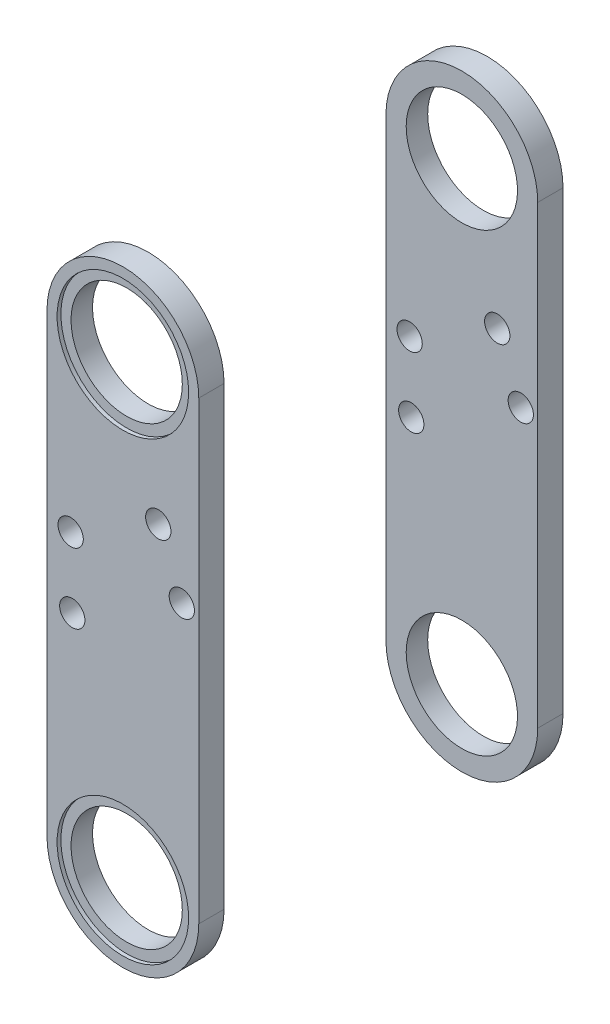
ISO-10303-21;
HEADER;
FILE_DESCRIPTION(('STEP AP214'),'2;1');
FILE_NAME('part.step','',(''),(''),'','','');
FILE_SCHEMA(('AUTOMOTIVE_DESIGN { 1 0 10303 214 1 1 1 1 }'));
ENDSEC;
DATA;
#1=APPLICATION_CONTEXT('core data for automotive mechanical design processes');
#2=APPLICATION_PROTOCOL_DEFINITION('international standard','automotive_design',2000,#1);
#3=PRODUCT_CONTEXT('',#1,'mechanical');
#4=PRODUCT('Part','Part','',(#3));
#5=PRODUCT_RELATED_PRODUCT_CATEGORY('part','',(#4));
#6=PRODUCT_DEFINITION_FORMATION('','',#4);
#7=PRODUCT_DEFINITION_CONTEXT('part definition',#1,'design');
#8=PRODUCT_DEFINITION('design','',#6,#7);
#9=PRODUCT_DEFINITION_SHAPE('','',#8);
#10=(LENGTH_UNIT() NAMED_UNIT(*) SI_UNIT(.MILLI.,.METRE.));
#11=(NAMED_UNIT(*) PLANE_ANGLE_UNIT() SI_UNIT($,.RADIAN.));
#12=(NAMED_UNIT(*) SI_UNIT($,.STERADIAN.) SOLID_ANGLE_UNIT());
#13=UNCERTAINTY_MEASURE_WITH_UNIT(LENGTH_MEASURE(1.E-05),#10,'distance_accuracy_value','');
#14=(GEOMETRIC_REPRESENTATION_CONTEXT(3) GLOBAL_UNCERTAINTY_ASSIGNED_CONTEXT((#13)) GLOBAL_UNIT_ASSIGNED_CONTEXT((#10,
#11,#12)) REPRESENTATION_CONTEXT('',''));
#15=CARTESIAN_POINT('',(0.,0.,0.));
#16=DIRECTION('',(0.,0.,1.));
#17=DIRECTION('',(1.,0.,0.));
#18=AXIS2_PLACEMENT_3D('',#15,#16,#17);
#19=CARTESIAN_POINT('',(0.,90.,72.));
#20=DIRECTION('',(0.,0.,-1.));
#21=DIRECTION('',(-1.,0.,0.));
#22=AXIS2_PLACEMENT_3D('',#19,#20,#21);
#23=CYLINDRICAL_SURFACE('',#22,11.);
#24=CARTESIAN_POINT('',(0.,90.,4.99999999999999));
#25=DIRECTION('',(0.,0.,-1.));
#26=DIRECTION('',(0.,1.,0.));
#27=AXIS2_PLACEMENT_3D('',#24,#25,#26);
#28=CIRCLE('',#27,11.);
#29=CARTESIAN_POINT('',(0.,101.,4.99999999999999));
#30=VERTEX_POINT('',#29);
#31=EDGE_CURVE('E125',#30,#30,#28,.T.);
#32=ORIENTED_EDGE('',*,*,#31,.F.);
#33=EDGE_LOOP('',(#32));
#34=FACE_BOUND('',#33,.T.);
#35=CARTESIAN_POINT('',(0.,90.,0.750000000000001));
#36=DIRECTION('',(0.,0.,-1.));
#37=DIRECTION('',(-1.,0.,0.));
#38=AXIS2_PLACEMENT_3D('',#35,#36,#37);
#39=CIRCLE('',#38,11.);
#40=CARTESIAN_POINT('',(-11.,90.,0.750000000000001));
#41=VERTEX_POINT('',#40);
#42=EDGE_CURVE('E73',#41,#41,#39,.T.);
#43=ORIENTED_EDGE('',*,*,#42,.T.);
#44=EDGE_LOOP('',(#43));
#45=FACE_BOUND('',#44,.T.);
#46=ADVANCED_FACE('F69',(#34,#45),#23,.F.);
#47=CARTESIAN_POINT('',(0.,0.,72.));
#48=DIRECTION('',(0.,0.,-1.));
#49=DIRECTION('',(-1.,0.,0.));
#50=AXIS2_PLACEMENT_3D('',#47,#48,#49);
#51=CYLINDRICAL_SURFACE('',#50,11.);
#52=CARTESIAN_POINT('',(0.,0.,5.00000000000002));
#53=DIRECTION('',(0.,0.,-1.));
#54=DIRECTION('',(0.,1.,0.));
#55=AXIS2_PLACEMENT_3D('',#52,#53,#54);
#56=CIRCLE('',#55,11.);
#57=CARTESIAN_POINT('',(0.,11.,5.00000000000002));
#58=VERTEX_POINT('',#57);
#59=EDGE_CURVE('E126',#58,#58,#56,.T.);
#60=ORIENTED_EDGE('',*,*,#59,.F.);
#61=EDGE_LOOP('',(#60));
#62=FACE_BOUND('',#61,.T.);
#63=CARTESIAN_POINT('',(0.,0.,0.750000000000001));
#64=DIRECTION('',(0.,0.,-1.));
#65=DIRECTION('',(-1.,0.,0.));
#66=AXIS2_PLACEMENT_3D('',#63,#64,#65);
#67=CIRCLE('',#66,11.);
#68=CARTESIAN_POINT('',(-11.,0.,0.750000000000001));
#69=VERTEX_POINT('',#68);
#70=EDGE_CURVE('E167',#69,#69,#67,.T.);
#71=ORIENTED_EDGE('',*,*,#70,.T.);
#72=EDGE_LOOP('',(#71));
#73=FACE_BOUND('',#72,.T.);
#74=ADVANCED_FACE('F194',(#62,#73),#51,.F.);
#75=CARTESIAN_POINT('',(11.650635094611,53.21224929608,72.));
#76=DIRECTION('',(0.,0.,-1.));
#77=DIRECTION('',(0.,1.,0.));
#78=AXIS2_PLACEMENT_3D('',#75,#76,#77);
#79=CYLINDRICAL_SURFACE('',#78,2.5);
#80=CARTESIAN_POINT('',(11.650635094611,53.21224929608,4.99999999999999));
#81=DIRECTION('',(0.,0.,-1.));
#82=DIRECTION('',(-1.,0.,0.));
#83=AXIS2_PLACEMENT_3D('',#80,#81,#82);
#84=CIRCLE('',#83,2.5);
#85=CARTESIAN_POINT('',(9.15063509461096,53.21224929608,4.99999999999999));
#86=VERTEX_POINT('',#85);
#87=EDGE_CURVE('E158',#86,#86,#84,.F.);
#88=ORIENTED_EDGE('',*,*,#87,.T.);
#89=EDGE_LOOP('',(#88));
#90=FACE_BOUND('',#89,.T.);
#91=CARTESIAN_POINT('',(11.650635094611,53.21224929608,0.));
#92=DIRECTION('',(0.,0.,-1.));
#93=DIRECTION('',(0.,1.,0.));
#94=AXIS2_PLACEMENT_3D('',#91,#92,#93);
#95=CIRCLE('',#94,2.5);
#96=CARTESIAN_POINT('',(11.650635094611,55.71224929608,0.));
#97=VERTEX_POINT('',#96);
#98=EDGE_CURVE('E155',#97,#97,#95,.T.);
#99=ORIENTED_EDGE('',*,*,#98,.T.);
#100=EDGE_LOOP('',(#99));
#101=FACE_BOUND('',#100,.T.);
#102=ADVANCED_FACE('F239',(#90,#101),#79,.F.);
#103=CARTESIAN_POINT('',(-10.,40.71224929608,72.));
#104=DIRECTION('',(0.,0.,-1.));
#105=DIRECTION('',(0.,1.,0.));
#106=AXIS2_PLACEMENT_3D('',#103,#104,#105);
#107=CYLINDRICAL_SURFACE('',#106,2.5);
#108=CARTESIAN_POINT('',(-10.,40.71224929608,4.99999999999999));
#109=DIRECTION('',(0.,0.,-1.));
#110=DIRECTION('',(-1.,0.,0.));
#111=AXIS2_PLACEMENT_3D('',#108,#109,#110);
#112=CIRCLE('',#111,2.5);
#113=CARTESIAN_POINT('',(-12.5,40.71224929608,4.99999999999999));
#114=VERTEX_POINT('',#113);
#115=EDGE_CURVE('E154',#114,#114,#112,.F.);
#116=ORIENTED_EDGE('',*,*,#115,.T.);
#117=EDGE_LOOP('',(#116));
#118=FACE_BOUND('',#117,.T.);
#119=CARTESIAN_POINT('',(-10.,40.71224929608,0.));
#120=DIRECTION('',(0.,0.,-1.));
#121=DIRECTION('',(0.,1.,0.));
#122=AXIS2_PLACEMENT_3D('',#119,#120,#121);
#123=CIRCLE('',#122,2.5);
#124=CARTESIAN_POINT('',(-10.,43.21224929608,0.));
#125=VERTEX_POINT('',#124);
#126=EDGE_CURVE('E150',#125,#125,#123,.T.);
#127=ORIENTED_EDGE('',*,*,#126,.T.);
#128=EDGE_LOOP('',(#127));
#129=FACE_BOUND('',#128,.T.);
#130=ADVANCED_FACE('F244',(#118,#129),#107,.F.);
#131=CARTESIAN_POINT('',(-10.3205080756888,54.4114817289327,72.));
#132=DIRECTION('',(0.,0.,-1.));
#133=DIRECTION('',(0.,1.,0.));
#134=AXIS2_PLACEMENT_3D('',#131,#132,#133);
#135=CYLINDRICAL_SURFACE('',#134,2.5);
#136=CARTESIAN_POINT('',(-10.3205080756888,54.4114817289327,4.99999999999999));
#137=DIRECTION('',(0.,0.,-1.));
#138=DIRECTION('',(-1.,0.,0.));
#139=AXIS2_PLACEMENT_3D('',#136,#137,#138);
#140=CIRCLE('',#139,2.5);
#141=CARTESIAN_POINT('',(-12.8205080756888,54.4114817289327,4.99999999999999));
#142=VERTEX_POINT('',#141);
#143=EDGE_CURVE('E153',#142,#142,#140,.F.);
#144=ORIENTED_EDGE('',*,*,#143,.T.);
#145=EDGE_LOOP('',(#144));
#146=FACE_BOUND('',#145,.T.);
#147=CARTESIAN_POINT('',(-10.3205080756888,54.4114817289327,0.));
#148=DIRECTION('',(0.,0.,-1.));
#149=DIRECTION('',(0.,1.,0.));
#150=AXIS2_PLACEMENT_3D('',#147,#148,#149);
#151=CIRCLE('',#150,2.5);
#152=CARTESIAN_POINT('',(-10.3205080756888,56.9114817289327,0.));
#153=VERTEX_POINT('',#152);
#154=EDGE_CURVE('E159',#153,#153,#151,.T.);
#155=ORIENTED_EDGE('',*,*,#154,.T.);
#156=EDGE_LOOP('',(#155));
#157=FACE_BOUND('',#156,.T.);
#158=ADVANCED_FACE('F247',(#146,#157),#135,.F.);
#159=CARTESIAN_POINT('',(7.,64.4114817289327,72.));
#160=DIRECTION('',(0.,0.,-1.));
#161=DIRECTION('',(0.,1.,0.));
#162=AXIS2_PLACEMENT_3D('',#159,#160,#161);
#163=CYLINDRICAL_SURFACE('',#162,2.5);
#164=CARTESIAN_POINT('',(7.,64.4114817289327,4.99999999999999));
#165=DIRECTION('',(0.,0.,-1.));
#166=DIRECTION('',(-1.,0.,0.));
#167=AXIS2_PLACEMENT_3D('',#164,#165,#166);
#168=CIRCLE('',#167,2.5);
#169=CARTESIAN_POINT('',(4.5,64.4114817289327,4.99999999999999));
#170=VERTEX_POINT('',#169);
#171=EDGE_CURVE('E162',#170,#170,#168,.F.);
#172=ORIENTED_EDGE('',*,*,#171,.T.);
#173=EDGE_LOOP('',(#172));
#174=FACE_BOUND('',#173,.T.);
#175=CARTESIAN_POINT('',(7.,64.4114817289327,0.));
#176=DIRECTION('',(0.,0.,-1.));
#177=DIRECTION('',(0.,1.,0.));
#178=AXIS2_PLACEMENT_3D('',#175,#176,#177);
#179=CIRCLE('',#178,2.5);
#180=CARTESIAN_POINT('',(7.,66.9114817289327,0.));
#181=VERTEX_POINT('',#180);
#182=EDGE_CURVE('E148',#181,#181,#179,.T.);
#183=ORIENTED_EDGE('',*,*,#182,.T.);
#184=EDGE_LOOP('',(#183));
#185=FACE_BOUND('',#184,.T.);
#186=ADVANCED_FACE('F71',(#174,#185),#163,.F.);
#187=CARTESIAN_POINT('',(55.,115.,4.99999999999999));
#188=DIRECTION('',(0.,0.,-1.));
#189=DIRECTION('',(0.,1.,0.));
#190=AXIS2_PLACEMENT_3D('',#187,#188,#189);
#191=PLANE('',#190);
#192=CARTESIAN_POINT('',(0.,90.,4.99999999999999));
#193=DIRECTION('',(0.,0.,-1.));
#194=DIRECTION('',(0.,1.,0.));
#195=AXIS2_PLACEMENT_3D('',#192,#193,#194);
#196=CIRCLE('',#195,15.);
#197=CARTESIAN_POINT('',(-15.,90.,5.));
#198=VERTEX_POINT('',#197);
#199=CARTESIAN_POINT('',(15.,90.,4.99999999999999));
#200=VERTEX_POINT('',#199);
#201=EDGE_CURVE('E122',#198,#200,#196,.T.);
#202=ORIENTED_EDGE('',*,*,#201,.F.);
#203=DIRECTION('',(0.,-1.,0.));
#204=VECTOR('',#203,1.);
#205=CARTESIAN_POINT('',(-15.,115.,4.99999999999999));
#206=LINE('',#205,#204);
#207=CARTESIAN_POINT('',(-15.,0.,5.00000000000002));
#208=VERTEX_POINT('',#207);
#209=EDGE_CURVE('E119',#198,#208,#206,.T.);
#210=ORIENTED_EDGE('',*,*,#209,.T.);
#211=CARTESIAN_POINT('',(0.,0.,5.00000000000002));
#212=DIRECTION('',(0.,0.,-1.));
#213=DIRECTION('',(0.,1.,0.));
#214=AXIS2_PLACEMENT_3D('',#211,#212,#213);
#215=CIRCLE('',#214,15.);
#216=CARTESIAN_POINT('',(15.,0.,5.));
#217=VERTEX_POINT('',#216);
#218=EDGE_CURVE('E105',#217,#208,#215,.T.);
#219=ORIENTED_EDGE('',*,*,#218,.F.);
#220=DIRECTION('',(0.,-1.,0.));
#221=VECTOR('',#220,1.);
#222=CARTESIAN_POINT('',(15.,90.,4.99999999999999));
#223=LINE('',#222,#221);
#224=EDGE_CURVE('E140',#200,#217,#223,.T.);
#225=ORIENTED_EDGE('',*,*,#224,.F.);
#226=EDGE_LOOP('',(#202,#210,#219,#225));
#227=FACE_BOUND('',#226,.T.);
#228=ORIENTED_EDGE('',*,*,#59,.T.);
#229=EDGE_LOOP('',(#228));
#230=FACE_BOUND('',#229,.T.);
#231=ORIENTED_EDGE('',*,*,#31,.T.);
#232=EDGE_LOOP('',(#231));
#233=FACE_BOUND('',#232,.T.);
#234=ORIENTED_EDGE('',*,*,#87,.F.);
#235=EDGE_LOOP('',(#234));
#236=FACE_BOUND('',#235,.T.);
#237=ORIENTED_EDGE('',*,*,#115,.F.);
#238=EDGE_LOOP('',(#237));
#239=FACE_BOUND('',#238,.T.);
#240=ORIENTED_EDGE('',*,*,#171,.F.);
#241=EDGE_LOOP('',(#240));
#242=FACE_BOUND('',#241,.T.);
#243=ORIENTED_EDGE('',*,*,#143,.F.);
#244=EDGE_LOOP('',(#243));
#245=FACE_BOUND('',#244,.T.);
#246=ADVANCED_FACE('F120',(#227,#230,#233,#236,#239,#242,#245),#191,.F.);
#247=CARTESIAN_POINT('',(15.,90.,72.));
#248=DIRECTION('',(-1.,0.,0.));
#249=DIRECTION('',(0.,-1.,0.));
#250=AXIS2_PLACEMENT_3D('',#247,#248,#249);
#251=PLANE('',#250);
#252=DIRECTION('',(0.,0.,-1.));
#253=VECTOR('',#252,1.);
#254=CARTESIAN_POINT('',(15.,90.,72.));
#255=LINE('',#254,#253);
#256=CARTESIAN_POINT('',(15.,90.,0.));
#257=VERTEX_POINT('',#256);
#258=EDGE_CURVE('E79',#200,#257,#255,.T.);
#259=ORIENTED_EDGE('',*,*,#258,.F.);
#260=ORIENTED_EDGE('',*,*,#224,.T.);
#261=DIRECTION('',(0.,0.,-1.));
#262=VECTOR('',#261,1.);
#263=CARTESIAN_POINT('',(15.,0.,72.));
#264=LINE('',#263,#262);
#265=CARTESIAN_POINT('',(15.,0.,0.));
#266=VERTEX_POINT('',#265);
#267=EDGE_CURVE('E112',#217,#266,#264,.T.);
#268=ORIENTED_EDGE('',*,*,#267,.T.);
#269=DIRECTION('',(0.,1.,0.));
#270=VECTOR('',#269,1.);
#271=CARTESIAN_POINT('',(15.,90.,0.));
#272=LINE('',#271,#270);
#273=EDGE_CURVE('E115',#266,#257,#272,.T.);
#274=ORIENTED_EDGE('',*,*,#273,.T.);
#275=EDGE_LOOP('',(#259,#260,#268,#274));
#276=FACE_BOUND('',#275,.T.);
#277=ADVANCED_FACE('F227',(#276),#251,.F.);
#278=CARTESIAN_POINT('',(0.,0.,72.));
#279=DIRECTION('',(0.,0.,-1.));
#280=DIRECTION('',(-1.,0.,0.));
#281=AXIS2_PLACEMENT_3D('',#278,#279,#280);
#282=CYLINDRICAL_SURFACE('',#281,15.);
#283=ORIENTED_EDGE('',*,*,#267,.F.);
#284=ORIENTED_EDGE('',*,*,#218,.T.);
#285=DIRECTION('',(0.,0.,-1.));
#286=VECTOR('',#285,1.);
#287=CARTESIAN_POINT('',(-15.,0.,72.));
#288=LINE('',#287,#286);
#289=CARTESIAN_POINT('',(-15.,0.,0.));
#290=VERTEX_POINT('',#289);
#291=EDGE_CURVE('E110',#208,#290,#288,.T.);
#292=ORIENTED_EDGE('',*,*,#291,.T.);
#293=CARTESIAN_POINT('',(0.,0.,0.));
#294=DIRECTION('',(0.,0.,1.));
#295=DIRECTION('',(1.,0.,0.));
#296=AXIS2_PLACEMENT_3D('',#293,#294,#295);
#297=CIRCLE('',#296,15.);
#298=EDGE_CURVE('E132',#290,#266,#297,.T.);
#299=ORIENTED_EDGE('',*,*,#298,.T.);
#300=EDGE_LOOP('',(#283,#284,#292,#299));
#301=FACE_BOUND('',#300,.T.);
#302=ADVANCED_FACE('F107',(#301),#282,.T.);
#303=CARTESIAN_POINT('',(-15.,90.,72.));
#304=DIRECTION('',(1.,0.,0.));
#305=DIRECTION('',(0.,1.,0.));
#306=AXIS2_PLACEMENT_3D('',#303,#304,#305);
#307=PLANE('',#306);
#308=ORIENTED_EDGE('',*,*,#291,.F.);
#309=ORIENTED_EDGE('',*,*,#209,.F.);
#310=DIRECTION('',(0.,0.,-1.));
#311=VECTOR('',#310,1.);
#312=CARTESIAN_POINT('',(-15.,90.,72.));
#313=LINE('',#312,#311);
#314=CARTESIAN_POINT('',(-15.,90.,0.));
#315=VERTEX_POINT('',#314);
#316=EDGE_CURVE('E134',#198,#315,#313,.T.);
#317=ORIENTED_EDGE('',*,*,#316,.T.);
#318=DIRECTION('',(0.,-1.,0.));
#319=VECTOR('',#318,1.);
#320=CARTESIAN_POINT('',(-15.,90.,0.));
#321=LINE('',#320,#319);
#322=EDGE_CURVE('E130',#315,#290,#321,.T.);
#323=ORIENTED_EDGE('',*,*,#322,.T.);
#324=EDGE_LOOP('',(#308,#309,#317,#323));
#325=FACE_BOUND('',#324,.T.);
#326=ADVANCED_FACE('F128',(#325),#307,.F.);
#327=CARTESIAN_POINT('',(0.,90.,72.));
#328=DIRECTION('',(0.,0.,-1.));
#329=DIRECTION('',(-1.,0.,0.));
#330=AXIS2_PLACEMENT_3D('',#327,#328,#329);
#331=CYLINDRICAL_SURFACE('',#330,15.);
#332=ORIENTED_EDGE('',*,*,#316,.F.);
#333=ORIENTED_EDGE('',*,*,#201,.T.);
#334=ORIENTED_EDGE('',*,*,#258,.T.);
#335=CARTESIAN_POINT('',(0.,90.,0.));
#336=DIRECTION('',(0.,0.,1.));
#337=DIRECTION('',(1.,0.,0.));
#338=AXIS2_PLACEMENT_3D('',#335,#336,#337);
#339=CIRCLE('',#338,15.);
#340=EDGE_CURVE('E13',#257,#315,#339,.T.);
#341=ORIENTED_EDGE('',*,*,#340,.T.);
#342=EDGE_LOOP('',(#332,#333,#334,#341));
#343=FACE_BOUND('',#342,.T.);
#344=ADVANCED_FACE('F212',(#343),#331,.T.);
#345=CARTESIAN_POINT('',(0.,90.,0.));
#346=DIRECTION('',(0.,0.,1.));
#347=DIRECTION('',(1.,0.,0.));
#348=AXIS2_PLACEMENT_3D('',#345,#346,#347);
#349=PLANE('',#348);
#350=CARTESIAN_POINT('',(0.,90.,0.));
#351=DIRECTION('',(0.,0.,-1.));
#352=DIRECTION('',(-1.,0.,0.));
#353=AXIS2_PLACEMENT_3D('',#350,#351,#352);
#354=CIRCLE('',#353,13.);
#355=CARTESIAN_POINT('',(-13.,90.,0.));
#356=VERTEX_POINT('',#355);
#357=EDGE_CURVE('E183',#356,#356,#354,.T.);
#358=ORIENTED_EDGE('',*,*,#357,.F.);
#359=EDGE_LOOP('',(#358));
#360=FACE_BOUND('',#359,.T.);
#361=CARTESIAN_POINT('',(0.,0.,0.));
#362=DIRECTION('',(0.,0.,-1.));
#363=DIRECTION('',(-1.,0.,0.));
#364=AXIS2_PLACEMENT_3D('',#361,#362,#363);
#365=CIRCLE('',#364,13.);
#366=CARTESIAN_POINT('',(-13.,0.,0.));
#367=VERTEX_POINT('',#366);
#368=EDGE_CURVE('E176',#367,#367,#365,.T.);
#369=ORIENTED_EDGE('',*,*,#368,.F.);
#370=EDGE_LOOP('',(#369));
#371=FACE_BOUND('',#370,.T.);
#372=ORIENTED_EDGE('',*,*,#182,.F.);
#373=EDGE_LOOP('',(#372));
#374=FACE_BOUND('',#373,.T.);
#375=ORIENTED_EDGE('',*,*,#154,.F.);
#376=EDGE_LOOP('',(#375));
#377=FACE_BOUND('',#376,.T.);
#378=ORIENTED_EDGE('',*,*,#126,.F.);
#379=EDGE_LOOP('',(#378));
#380=FACE_BOUND('',#379,.T.);
#381=ORIENTED_EDGE('',*,*,#98,.F.);
#382=EDGE_LOOP('',(#381));
#383=FACE_BOUND('',#382,.T.);
#384=ORIENTED_EDGE('',*,*,#340,.F.);
#385=ORIENTED_EDGE('',*,*,#273,.F.);
#386=ORIENTED_EDGE('',*,*,#298,.F.);
#387=ORIENTED_EDGE('',*,*,#322,.F.);
#388=EDGE_LOOP('',(#384,#385,#386,#387));
#389=FACE_BOUND('',#388,.T.);
#390=ADVANCED_FACE('F208',(#360,#371,#374,#377,#380,#383,#389),#349,.F.);
#391=CARTESIAN_POINT('',(0.,0.,0.75));
#392=DIRECTION('',(0.,0.,-1.));
#393=DIRECTION('',(-1.,0.,0.));
#394=AXIS2_PLACEMENT_3D('',#391,#392,#393);
#395=CYLINDRICAL_SURFACE('',#394,13.);
#396=CARTESIAN_POINT('',(0.,0.,0.75));
#397=DIRECTION('',(0.,0.,-1.));
#398=DIRECTION('',(-1.,0.,0.));
#399=AXIS2_PLACEMENT_3D('',#396,#397,#398);
#400=CIRCLE('',#399,13.);
#401=CARTESIAN_POINT('',(-13.,0.,0.75));
#402=VERTEX_POINT('',#401);
#403=EDGE_CURVE('E172',#402,#402,#400,.T.);
#404=ORIENTED_EDGE('',*,*,#403,.F.);
#405=EDGE_LOOP('',(#404));
#406=FACE_BOUND('',#405,.T.);
#407=ORIENTED_EDGE('',*,*,#368,.T.);
#408=EDGE_LOOP('',(#407));
#409=FACE_BOUND('',#408,.T.);
#410=ADVANCED_FACE('F211',(#406,#409),#395,.F.);
#411=CARTESIAN_POINT('',(0.,0.,0.75));
#412=DIRECTION('',(0.,0.,-1.));
#413=DIRECTION('',(-1.,0.,0.));
#414=AXIS2_PLACEMENT_3D('',#411,#412,#413);
#415=PLANE('',#414);
#416=ORIENTED_EDGE('',*,*,#70,.F.);
#417=EDGE_LOOP('',(#416));
#418=FACE_BOUND('',#417,.T.);
#419=ORIENTED_EDGE('',*,*,#403,.T.);
#420=EDGE_LOOP('',(#419));
#421=FACE_BOUND('',#420,.T.);
#422=ADVANCED_FACE('F310',(#418,#421),#415,.T.);
#423=CARTESIAN_POINT('',(0.,90.,0.75));
#424=DIRECTION('',(0.,0.,-1.));
#425=DIRECTION('',(-1.,0.,0.));
#426=AXIS2_PLACEMENT_3D('',#423,#424,#425);
#427=CYLINDRICAL_SURFACE('',#426,13.);
#428=CARTESIAN_POINT('',(0.,90.,0.75));
#429=DIRECTION('',(0.,0.,-1.));
#430=DIRECTION('',(-1.,0.,0.));
#431=AXIS2_PLACEMENT_3D('',#428,#429,#430);
#432=CIRCLE('',#431,13.);
#433=CARTESIAN_POINT('',(-13.,90.,0.75));
#434=VERTEX_POINT('',#433);
#435=EDGE_CURVE('E199',#434,#434,#432,.T.);
#436=ORIENTED_EDGE('',*,*,#435,.F.);
#437=EDGE_LOOP('',(#436));
#438=FACE_BOUND('',#437,.T.);
#439=ORIENTED_EDGE('',*,*,#357,.T.);
#440=EDGE_LOOP('',(#439));
#441=FACE_BOUND('',#440,.T.);
#442=ADVANCED_FACE('F206',(#438,#441),#427,.F.);
#443=CARTESIAN_POINT('',(0.,90.,0.75));
#444=DIRECTION('',(0.,0.,-1.));
#445=DIRECTION('',(-1.,0.,0.));
#446=AXIS2_PLACEMENT_3D('',#443,#444,#445);
#447=PLANE('',#446);
#448=ORIENTED_EDGE('',*,*,#42,.F.);
#449=EDGE_LOOP('',(#448));
#450=FACE_BOUND('',#449,.T.);
#451=ORIENTED_EDGE('',*,*,#435,.T.);
#452=EDGE_LOOP('',(#451));
#453=FACE_BOUND('',#452,.T.);
#454=ADVANCED_FACE('F340',(#450,#453),#447,.T.);
#455=CLOSED_SHELL('',(#46,#74,#102,#130,#158,#186,#246,#277,#302,#326,#344,#390,#410,#422,#442,#454));
#456=MANIFOLD_SOLID_BREP('B2',#455);
#457=CARTESIAN_POINT('',(0.,90.,72.));
#458=DIRECTION('',(0.,0.,-1.));
#459=DIRECTION('',(-1.,0.,0.));
#460=AXIS2_PLACEMENT_3D('',#457,#458,#459);
#461=CYLINDRICAL_SURFACE('',#460,11.);
#462=CARTESIAN_POINT('',(0.,90.,67.));
#463=DIRECTION('',(0.,0.,-1.));
#464=DIRECTION('',(-1.,0.,0.));
#465=AXIS2_PLACEMENT_3D('',#462,#463,#464);
#466=CIRCLE('',#465,11.);
#467=CARTESIAN_POINT('',(-11.,90.,67.));
#468=VERTEX_POINT('',#467);
#469=EDGE_CURVE('E491',#468,#468,#466,.T.);
#470=ORIENTED_EDGE('',*,*,#469,.T.);
#471=EDGE_LOOP('',(#470));
#472=FACE_BOUND('',#471,.T.);
#473=CARTESIAN_POINT('',(0.,90.,71.25));
#474=DIRECTION('',(0.,0.,1.));
#475=DIRECTION('',(1.,0.,0.));
#476=AXIS2_PLACEMENT_3D('',#473,#474,#475);
#477=CIRCLE('',#476,11.);
#478=CARTESIAN_POINT('',(11.,90.,71.25));
#479=VERTEX_POINT('',#478);
#480=EDGE_CURVE('E388',#479,#479,#477,.T.);
#481=ORIENTED_EDGE('',*,*,#480,.T.);
#482=EDGE_LOOP('',(#481));
#483=FACE_BOUND('',#482,.T.);
#484=ADVANCED_FACE('F385',(#472,#483),#461,.F.);
#485=CARTESIAN_POINT('',(0.,0.,72.));
#486=DIRECTION('',(0.,0.,-1.));
#487=DIRECTION('',(-1.,0.,0.));
#488=AXIS2_PLACEMENT_3D('',#485,#486,#487);
#489=CYLINDRICAL_SURFACE('',#488,11.);
#490=CARTESIAN_POINT('',(0.,0.,67.));
#491=DIRECTION('',(0.,0.,-1.));
#492=DIRECTION('',(-1.,0.,0.));
#493=AXIS2_PLACEMENT_3D('',#490,#491,#492);
#494=CIRCLE('',#493,11.);
#495=CARTESIAN_POINT('',(-11.,0.,67.));
#496=VERTEX_POINT('',#495);
#497=EDGE_CURVE('E494',#496,#496,#494,.T.);
#498=ORIENTED_EDGE('',*,*,#497,.T.);
#499=EDGE_LOOP('',(#498));
#500=FACE_BOUND('',#499,.T.);
#501=CARTESIAN_POINT('',(0.,0.,71.25));
#502=DIRECTION('',(0.,0.,1.));
#503=DIRECTION('',(1.,0.,0.));
#504=AXIS2_PLACEMENT_3D('',#501,#502,#503);
#505=CIRCLE('',#504,11.);
#506=CARTESIAN_POINT('',(11.,0.,71.25));
#507=VERTEX_POINT('',#506);
#508=EDGE_CURVE('E459',#507,#507,#505,.T.);
#509=ORIENTED_EDGE('',*,*,#508,.T.);
#510=EDGE_LOOP('',(#509));
#511=FACE_BOUND('',#510,.T.);
#512=ADVANCED_FACE('F530',(#500,#511),#489,.F.);
#513=CARTESIAN_POINT('',(0.,0.,72.));
#514=DIRECTION('',(0.,0.,-1.));
#515=DIRECTION('',(-1.,0.,0.));
#516=AXIS2_PLACEMENT_3D('',#513,#514,#515);
#517=CYLINDRICAL_SURFACE('',#516,15.);
#518=CARTESIAN_POINT('',(0.,0.,67.));
#519=DIRECTION('',(0.,0.,-1.));
#520=DIRECTION('',(-1.,0.,0.));
#521=AXIS2_PLACEMENT_3D('',#518,#519,#520);
#522=CIRCLE('',#521,15.);
#523=CARTESIAN_POINT('',(15.,0.,67.));
#524=VERTEX_POINT('',#523);
#525=CARTESIAN_POINT('',(-15.,0.,67.));
#526=VERTEX_POINT('',#525);
#527=EDGE_CURVE('E393',#524,#526,#522,.T.);
#528=ORIENTED_EDGE('',*,*,#527,.F.);
#529=DIRECTION('',(0.,0.,-1.));
#530=VECTOR('',#529,1.);
#531=CARTESIAN_POINT('',(15.,0.,72.));
#532=LINE('',#531,#530);
#533=CARTESIAN_POINT('',(15.,0.,72.));
#534=VERTEX_POINT('',#533);
#535=EDGE_CURVE('E440',#534,#524,#532,.T.);
#536=ORIENTED_EDGE('',*,*,#535,.F.);
#537=CARTESIAN_POINT('',(0.,0.,72.));
#538=DIRECTION('',(0.,0.,1.));
#539=DIRECTION('',(1.,0.,0.));
#540=AXIS2_PLACEMENT_3D('',#537,#538,#539);
#541=CIRCLE('',#540,15.);
#542=CARTESIAN_POINT('',(-15.,0.,72.));
#543=VERTEX_POINT('',#542);
#544=EDGE_CURVE('E496',#543,#534,#541,.T.);
#545=ORIENTED_EDGE('',*,*,#544,.F.);
#546=DIRECTION('',(0.,0.,-1.));
#547=VECTOR('',#546,1.);
#548=CARTESIAN_POINT('',(-15.,0.,72.));
#549=LINE('',#548,#547);
#550=EDGE_CURVE('E448',#543,#526,#549,.T.);
#551=ORIENTED_EDGE('',*,*,#550,.T.);
#552=EDGE_LOOP('',(#528,#536,#545,#551));
#553=FACE_BOUND('',#552,.T.);
#554=ADVANCED_FACE('F506',(#553),#517,.T.);
#555=CARTESIAN_POINT('',(0.,90.,72.));
#556=DIRECTION('',(0.,0.,-1.));
#557=DIRECTION('',(-1.,0.,0.));
#558=AXIS2_PLACEMENT_3D('',#555,#556,#557);
#559=CYLINDRICAL_SURFACE('',#558,15.);
#560=CARTESIAN_POINT('',(0.,90.,67.));
#561=DIRECTION('',(0.,0.,-1.));
#562=DIRECTION('',(-1.,0.,0.));
#563=AXIS2_PLACEMENT_3D('',#560,#561,#562);
#564=CIRCLE('',#563,15.);
#565=CARTESIAN_POINT('',(-15.,90.,67.));
#566=VERTEX_POINT('',#565);
#567=CARTESIAN_POINT('',(15.,90.,67.));
#568=VERTEX_POINT('',#567);
#569=EDGE_CURVE('E421',#566,#568,#564,.T.);
#570=ORIENTED_EDGE('',*,*,#569,.F.);
#571=DIRECTION('',(0.,0.,-1.));
#572=VECTOR('',#571,1.);
#573=CARTESIAN_POINT('',(-15.,90.,72.));
#574=LINE('',#573,#572);
#575=CARTESIAN_POINT('',(-15.,90.,72.));
#576=VERTEX_POINT('',#575);
#577=EDGE_CURVE('E445',#576,#566,#574,.T.);
#578=ORIENTED_EDGE('',*,*,#577,.F.);
#579=CARTESIAN_POINT('',(0.,90.,72.));
#580=DIRECTION('',(0.,0.,1.));
#581=DIRECTION('',(1.,0.,0.));
#582=AXIS2_PLACEMENT_3D('',#579,#580,#581);
#583=CIRCLE('',#582,15.);
#584=CARTESIAN_POINT('',(15.,90.,72.));
#585=VERTEX_POINT('',#584);
#586=EDGE_CURVE('E444',#585,#576,#583,.T.);
#587=ORIENTED_EDGE('',*,*,#586,.F.);
#588=DIRECTION('',(0.,0.,-1.));
#589=VECTOR('',#588,1.);
#590=CARTESIAN_POINT('',(15.,90.,72.));
#591=LINE('',#590,#589);
#592=EDGE_CURVE('E437',#585,#568,#591,.T.);
#593=ORIENTED_EDGE('',*,*,#592,.T.);
#594=EDGE_LOOP('',(#570,#578,#587,#593));
#595=FACE_BOUND('',#594,.T.);
#596=ADVANCED_FACE('F442',(#595),#559,.T.);
#597=CARTESIAN_POINT('',(55.,115.,67.));
#598=DIRECTION('',(0.,0.,-1.));
#599=DIRECTION('',(-1.,0.,0.));
#600=AXIS2_PLACEMENT_3D('',#597,#598,#599);
#601=PLANE('',#600);
#602=ORIENTED_EDGE('',*,*,#527,.T.);
#603=DIRECTION('',(0.,-1.,0.));
#604=VECTOR('',#603,1.);
#605=CARTESIAN_POINT('',(-15.,115.,67.));
#606=LINE('',#605,#604);
#607=EDGE_CURVE('E67',#566,#526,#606,.T.);
#608=ORIENTED_EDGE('',*,*,#607,.F.);
#609=ORIENTED_EDGE('',*,*,#569,.T.);
#610=DIRECTION('',(0.,-1.,0.));
#611=VECTOR('',#610,1.);
#612=CARTESIAN_POINT('',(15.,90.,67.));
#613=LINE('',#612,#611);
#614=EDGE_CURVE('E425',#568,#524,#613,.T.);
#615=ORIENTED_EDGE('',*,*,#614,.T.);
#616=EDGE_LOOP('',(#602,#608,#609,#615));
#617=FACE_BOUND('',#616,.T.);
#618=ORIENTED_EDGE('',*,*,#469,.F.);
#619=EDGE_LOOP('',(#618));
#620=FACE_BOUND('',#619,.T.);
#621=CARTESIAN_POINT('',(11.650635094611,53.21224929608,67.));
#622=DIRECTION('',(0.,0.,1.));
#623=DIRECTION('',(1.,0.,0.));
#624=AXIS2_PLACEMENT_3D('',#621,#622,#623);
#625=CIRCLE('',#624,2.5);
#626=CARTESIAN_POINT('',(14.150635094611,53.21224929608,67.));
#627=VERTEX_POINT('',#626);
#628=EDGE_CURVE('E480',#627,#627,#625,.F.);
#629=ORIENTED_EDGE('',*,*,#628,.F.);
#630=EDGE_LOOP('',(#629));
#631=FACE_BOUND('',#630,.T.);
#632=CARTESIAN_POINT('',(-10.,40.71224929608,67.));
#633=DIRECTION('',(0.,0.,1.));
#634=DIRECTION('',(1.,0.,0.));
#635=AXIS2_PLACEMENT_3D('',#632,#633,#634);
#636=CIRCLE('',#635,2.5);
#637=CARTESIAN_POINT('',(-7.50000000000001,40.71224929608,67.));
#638=VERTEX_POINT('',#637);
#639=EDGE_CURVE('E477',#638,#638,#636,.F.);
#640=ORIENTED_EDGE('',*,*,#639,.F.);
#641=EDGE_LOOP('',(#640));
#642=FACE_BOUND('',#641,.T.);
#643=ORIENTED_EDGE('',*,*,#497,.F.);
#644=EDGE_LOOP('',(#643));
#645=FACE_BOUND('',#644,.T.);
#646=CARTESIAN_POINT('',(7.,64.4114817289327,67.));
#647=DIRECTION('',(0.,0.,1.));
#648=DIRECTION('',(1.,0.,0.));
#649=AXIS2_PLACEMENT_3D('',#646,#647,#648);
#650=CIRCLE('',#649,2.5);
#651=CARTESIAN_POINT('',(9.5,64.4114817289327,67.));
#652=VERTEX_POINT('',#651);
#653=EDGE_CURVE('E456',#652,#652,#650,.F.);
#654=ORIENTED_EDGE('',*,*,#653,.F.);
#655=EDGE_LOOP('',(#654));
#656=FACE_BOUND('',#655,.T.);
#657=CARTESIAN_POINT('',(-10.3205080756888,54.4114817289327,67.));
#658=DIRECTION('',(0.,0.,1.));
#659=DIRECTION('',(1.,0.,0.));
#660=AXIS2_PLACEMENT_3D('',#657,#658,#659);
#661=CIRCLE('',#660,2.5);
#662=CARTESIAN_POINT('',(-7.82050807568877,54.4114817289327,67.));
#663=VERTEX_POINT('',#662);
#664=EDGE_CURVE('E458',#663,#663,#661,.F.);
#665=ORIENTED_EDGE('',*,*,#664,.F.);
#666=EDGE_LOOP('',(#665));
#667=FACE_BOUND('',#666,.T.);
#668=ADVANCED_FACE('F423',(#617,#620,#631,#642,#645,#656,#667),#601,.T.);
#669=CARTESIAN_POINT('',(15.,90.,72.));
#670=DIRECTION('',(-1.,0.,0.));
#671=DIRECTION('',(0.,-1.,0.));
#672=AXIS2_PLACEMENT_3D('',#669,#670,#671);
#673=PLANE('',#672);
#674=ORIENTED_EDGE('',*,*,#614,.F.);
#675=ORIENTED_EDGE('',*,*,#592,.F.);
#676=DIRECTION('',(0.,1.,0.));
#677=VECTOR('',#676,1.);
#678=CARTESIAN_POINT('',(15.,90.,72.));
#679=LINE('',#678,#677);
#680=EDGE_CURVE('E430',#534,#585,#679,.T.);
#681=ORIENTED_EDGE('',*,*,#680,.F.);
#682=ORIENTED_EDGE('',*,*,#535,.T.);
#683=EDGE_LOOP('',(#674,#675,#681,#682));
#684=FACE_BOUND('',#683,.T.);
#685=ADVANCED_FACE('F435',(#684),#673,.F.);
#686=CARTESIAN_POINT('',(-15.,90.,72.));
#687=DIRECTION('',(1.,0.,0.));
#688=DIRECTION('',(0.,1.,0.));
#689=AXIS2_PLACEMENT_3D('',#686,#687,#688);
#690=PLANE('',#689);
#691=ORIENTED_EDGE('',*,*,#577,.T.);
#692=ORIENTED_EDGE('',*,*,#607,.T.);
#693=ORIENTED_EDGE('',*,*,#550,.F.);
#694=DIRECTION('',(0.,-1.,0.));
#695=VECTOR('',#694,1.);
#696=CARTESIAN_POINT('',(-15.,90.,72.));
#697=LINE('',#696,#695);
#698=EDGE_CURVE('E498',#576,#543,#697,.T.);
#699=ORIENTED_EDGE('',*,*,#698,.F.);
#700=EDGE_LOOP('',(#691,#692,#693,#699));
#701=FACE_BOUND('',#700,.T.);
#702=ADVANCED_FACE('F507',(#701),#690,.F.);
#703=CARTESIAN_POINT('',(11.650635094611,53.21224929608,72.));
#704=DIRECTION('',(0.,0.,-1.));
#705=DIRECTION('',(0.,1.,0.));
#706=AXIS2_PLACEMENT_3D('',#703,#704,#705);
#707=CYLINDRICAL_SURFACE('',#706,2.5);
#708=ORIENTED_EDGE('',*,*,#628,.T.);
#709=EDGE_LOOP('',(#708));
#710=FACE_BOUND('',#709,.T.);
#711=CARTESIAN_POINT('',(11.650635094611,53.21224929608,72.));
#712=DIRECTION('',(0.,0.,-1.));
#713=DIRECTION('',(0.,1.,0.));
#714=AXIS2_PLACEMENT_3D('',#711,#712,#713);
#715=CIRCLE('',#714,2.5);
#716=CARTESIAN_POINT('',(11.650635094611,55.71224929608,72.));
#717=VERTEX_POINT('',#716);
#718=EDGE_CURVE('E451',#717,#717,#715,.T.);
#719=ORIENTED_EDGE('',*,*,#718,.F.);
#720=EDGE_LOOP('',(#719));
#721=FACE_BOUND('',#720,.T.);
#722=ADVANCED_FACE('F565',(#710,#721),#707,.F.);
#723=CARTESIAN_POINT('',(-10.,40.71224929608,72.));
#724=DIRECTION('',(0.,0.,-1.));
#725=DIRECTION('',(0.,1.,0.));
#726=AXIS2_PLACEMENT_3D('',#723,#724,#725);
#727=CYLINDRICAL_SURFACE('',#726,2.5);
#728=ORIENTED_EDGE('',*,*,#639,.T.);
#729=EDGE_LOOP('',(#728));
#730=FACE_BOUND('',#729,.T.);
#731=CARTESIAN_POINT('',(-10.,40.71224929608,72.));
#732=DIRECTION('',(0.,0.,-1.));
#733=DIRECTION('',(0.,1.,0.));
#734=AXIS2_PLACEMENT_3D('',#731,#732,#733);
#735=CIRCLE('',#734,2.5);
#736=CARTESIAN_POINT('',(-10.,43.2122492960801,72.));
#737=VERTEX_POINT('',#736);
#738=EDGE_CURVE('E486',#737,#737,#735,.T.);
#739=ORIENTED_EDGE('',*,*,#738,.F.);
#740=EDGE_LOOP('',(#739));
#741=FACE_BOUND('',#740,.T.);
#742=ADVANCED_FACE('F522',(#730,#741),#727,.F.);
#743=CARTESIAN_POINT('',(-10.3205080756888,54.4114817289327,72.));
#744=DIRECTION('',(0.,0.,-1.));
#745=DIRECTION('',(0.,1.,0.));
#746=AXIS2_PLACEMENT_3D('',#743,#744,#745);
#747=CYLINDRICAL_SURFACE('',#746,2.5);
#748=ORIENTED_EDGE('',*,*,#664,.T.);
#749=EDGE_LOOP('',(#748));
#750=FACE_BOUND('',#749,.T.);
#751=CARTESIAN_POINT('',(-10.3205080756888,54.4114817289327,72.));
#752=DIRECTION('',(0.,0.,-1.));
#753=DIRECTION('',(0.,1.,0.));
#754=AXIS2_PLACEMENT_3D('',#751,#752,#753);
#755=CIRCLE('',#754,2.5);
#756=CARTESIAN_POINT('',(-10.3205080756888,56.9114817289327,72.));
#757=VERTEX_POINT('',#756);
#758=EDGE_CURVE('E482',#757,#757,#755,.T.);
#759=ORIENTED_EDGE('',*,*,#758,.F.);
#760=EDGE_LOOP('',(#759));
#761=FACE_BOUND('',#760,.T.);
#762=ADVANCED_FACE('F512',(#750,#761),#747,.F.);
#763=CARTESIAN_POINT('',(0.,90.,72.));
#764=DIRECTION('',(0.,0.,1.));
#765=DIRECTION('',(1.,0.,0.));
#766=AXIS2_PLACEMENT_3D('',#763,#764,#765);
#767=PLANE('',#766);
#768=CARTESIAN_POINT('',(0.,90.,72.));
#769=DIRECTION('',(0.,0.,1.));
#770=DIRECTION('',(1.,0.,0.));
#771=AXIS2_PLACEMENT_3D('',#768,#769,#770);
#772=CIRCLE('',#771,13.);
#773=CARTESIAN_POINT('',(13.,90.,72.));
#774=VERTEX_POINT('',#773);
#775=EDGE_CURVE('E472',#774,#774,#772,.T.);
#776=ORIENTED_EDGE('',*,*,#775,.F.);
#777=EDGE_LOOP('',(#776));
#778=FACE_BOUND('',#777,.T.);
#779=CARTESIAN_POINT('',(0.,0.,72.));
#780=DIRECTION('',(0.,0.,1.));
#781=DIRECTION('',(1.,0.,0.));
#782=AXIS2_PLACEMENT_3D('',#779,#780,#781);
#783=CIRCLE('',#782,13.);
#784=CARTESIAN_POINT('',(13.,0.,72.));
#785=VERTEX_POINT('',#784);
#786=EDGE_CURVE('E465',#785,#785,#783,.T.);
#787=ORIENTED_EDGE('',*,*,#786,.F.);
#788=EDGE_LOOP('',(#787));
#789=FACE_BOUND('',#788,.T.);
#790=CARTESIAN_POINT('',(7.,64.4114817289327,72.));
#791=DIRECTION('',(0.,0.,-1.));
#792=DIRECTION('',(0.,1.,0.));
#793=AXIS2_PLACEMENT_3D('',#790,#791,#792);
#794=CIRCLE('',#793,2.5);
#795=CARTESIAN_POINT('',(7.,66.9114817289327,72.));
#796=VERTEX_POINT('',#795);
#797=EDGE_CURVE('E446',#796,#796,#794,.T.);
#798=ORIENTED_EDGE('',*,*,#797,.T.);
#799=EDGE_LOOP('',(#798));
#800=FACE_BOUND('',#799,.T.);
#801=ORIENTED_EDGE('',*,*,#758,.T.);
#802=EDGE_LOOP('',(#801));
#803=FACE_BOUND('',#802,.T.);
#804=ORIENTED_EDGE('',*,*,#738,.T.);
#805=EDGE_LOOP('',(#804));
#806=FACE_BOUND('',#805,.T.);
#807=ORIENTED_EDGE('',*,*,#718,.T.);
#808=EDGE_LOOP('',(#807));
#809=FACE_BOUND('',#808,.T.);
#810=ORIENTED_EDGE('',*,*,#586,.T.);
#811=ORIENTED_EDGE('',*,*,#698,.T.);
#812=ORIENTED_EDGE('',*,*,#544,.T.);
#813=ORIENTED_EDGE('',*,*,#680,.T.);
#814=EDGE_LOOP('',(#810,#811,#812,#813));
#815=FACE_BOUND('',#814,.T.);
#816=ADVANCED_FACE('F509',(#778,#789,#800,#803,#806,#809,#815),#767,.T.);
#817=CARTESIAN_POINT('',(7.,64.4114817289327,72.));
#818=DIRECTION('',(0.,0.,-1.));
#819=DIRECTION('',(0.,1.,0.));
#820=AXIS2_PLACEMENT_3D('',#817,#818,#819);
#821=CYLINDRICAL_SURFACE('',#820,2.5);
#822=ORIENTED_EDGE('',*,*,#653,.T.);
#823=EDGE_LOOP('',(#822));
#824=FACE_BOUND('',#823,.T.);
#825=ORIENTED_EDGE('',*,*,#797,.F.);
#826=EDGE_LOOP('',(#825));
#827=FACE_BOUND('',#826,.T.);
#828=ADVANCED_FACE('F511',(#824,#827),#821,.F.);
#829=CARTESIAN_POINT('',(0.,0.,71.25));
#830=DIRECTION('',(0.,0.,1.));
#831=DIRECTION('',(1.,0.,0.));
#832=AXIS2_PLACEMENT_3D('',#829,#830,#831);
#833=CYLINDRICAL_SURFACE('',#832,13.);
#834=CARTESIAN_POINT('',(0.,0.,71.25));
#835=DIRECTION('',(0.,0.,1.));
#836=DIRECTION('',(1.,0.,0.));
#837=AXIS2_PLACEMENT_3D('',#834,#835,#836);
#838=CIRCLE('',#837,13.);
#839=CARTESIAN_POINT('',(13.,0.,71.25));
#840=VERTEX_POINT('',#839);
#841=EDGE_CURVE('E461',#840,#840,#838,.T.);
#842=ORIENTED_EDGE('',*,*,#841,.F.);
#843=EDGE_LOOP('',(#842));
#844=FACE_BOUND('',#843,.T.);
#845=ORIENTED_EDGE('',*,*,#786,.T.);
#846=EDGE_LOOP('',(#845));
#847=FACE_BOUND('',#846,.T.);
#848=ADVANCED_FACE('F519',(#844,#847),#833,.F.);
#849=CARTESIAN_POINT('',(0.,0.,71.25));
#850=DIRECTION('',(0.,0.,1.));
#851=DIRECTION('',(1.,0.,0.));
#852=AXIS2_PLACEMENT_3D('',#849,#850,#851);
#853=PLANE('',#852);
#854=ORIENTED_EDGE('',*,*,#508,.F.);
#855=EDGE_LOOP('',(#854));
#856=FACE_BOUND('',#855,.T.);
#857=ORIENTED_EDGE('',*,*,#841,.T.);
#858=EDGE_LOOP('',(#857));
#859=FACE_BOUND('',#858,.T.);
#860=ADVANCED_FACE('F551',(#856,#859),#853,.T.);
#861=CARTESIAN_POINT('',(0.,90.,71.25));
#862=DIRECTION('',(0.,0.,1.));
#863=DIRECTION('',(1.,0.,0.));
#864=AXIS2_PLACEMENT_3D('',#861,#862,#863);
#865=CYLINDRICAL_SURFACE('',#864,13.);
#866=CARTESIAN_POINT('',(0.,90.,71.25));
#867=DIRECTION('',(0.,0.,1.));
#868=DIRECTION('',(1.,0.,0.));
#869=AXIS2_PLACEMENT_3D('',#866,#867,#868);
#870=CIRCLE('',#869,13.);
#871=CARTESIAN_POINT('',(13.,90.,71.25));
#872=VERTEX_POINT('',#871);
#873=EDGE_CURVE('E542',#872,#872,#870,.T.);
#874=ORIENTED_EDGE('',*,*,#873,.F.);
#875=EDGE_LOOP('',(#874));
#876=FACE_BOUND('',#875,.T.);
#877=ORIENTED_EDGE('',*,*,#775,.T.);
#878=EDGE_LOOP('',(#877));
#879=FACE_BOUND('',#878,.T.);
#880=ADVANCED_FACE('F548',(#876,#879),#865,.F.);
#881=CARTESIAN_POINT('',(0.,90.,71.25));
#882=DIRECTION('',(0.,0.,1.));
#883=DIRECTION('',(1.,0.,0.));
#884=AXIS2_PLACEMENT_3D('',#881,#882,#883);
#885=PLANE('',#884);
#886=ORIENTED_EDGE('',*,*,#480,.F.);
#887=EDGE_LOOP('',(#886));
#888=FACE_BOUND('',#887,.T.);
#889=ORIENTED_EDGE('',*,*,#873,.T.);
#890=EDGE_LOOP('',(#889));
#891=FACE_BOUND('',#890,.T.);
#892=ADVANCED_FACE('F550',(#888,#891),#885,.T.);
#893=CLOSED_SHELL('',(#484,#512,#554,#596,#668,#685,#702,#722,#742,#762,#816,#828,#848,#860,
#880,#892));
#894=MANIFOLD_SOLID_BREP('B7',#893);
#895=ADVANCED_BREP_SHAPE_REPRESENTATION('',(#18,#456,#894),#14);
#896=SHAPE_DEFINITION_REPRESENTATION(#9,#895);
ENDSEC;
END-ISO-10303-21;
